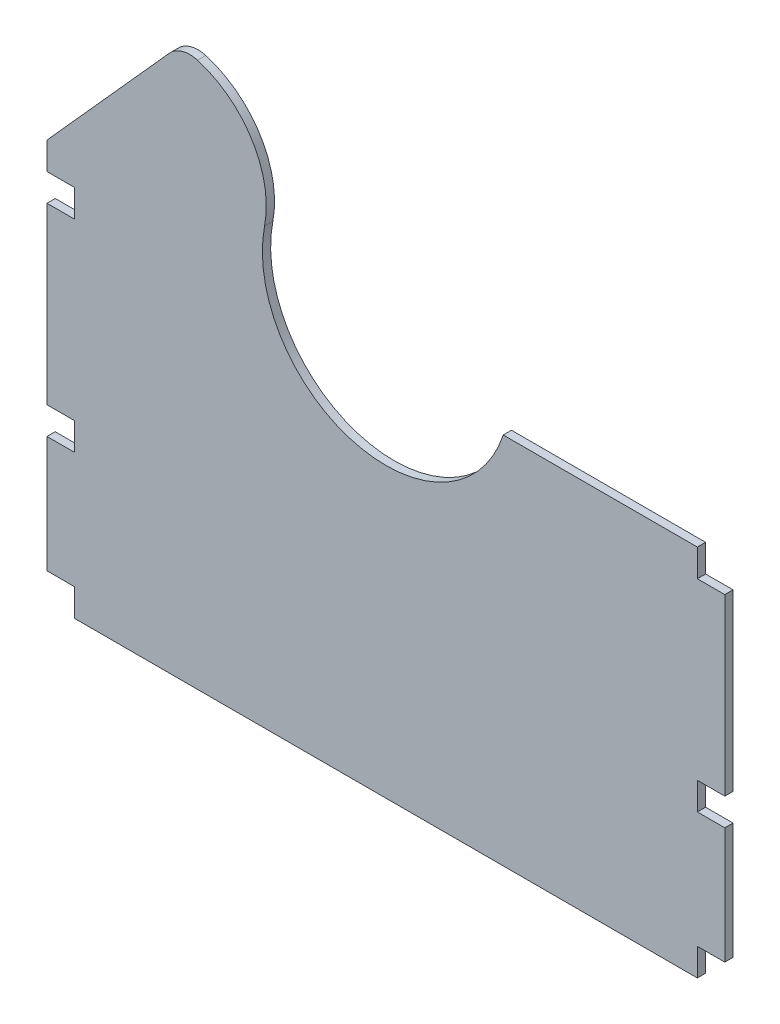
ISO-10303-21;
HEADER;
FILE_DESCRIPTION(('STEP AP214'),'2;1');
FILE_NAME('part.step','',(''),(''),'','','');
FILE_SCHEMA(('AUTOMOTIVE_DESIGN { 1 0 10303 214 1 1 1 1 }'));
ENDSEC;
DATA;
#1=APPLICATION_CONTEXT('core data for automotive mechanical design processes');
#2=APPLICATION_PROTOCOL_DEFINITION('international standard','automotive_design',2000,#1);
#3=PRODUCT_CONTEXT('',#1,'mechanical');
#4=PRODUCT('Part','Part','',(#3));
#5=PRODUCT_RELATED_PRODUCT_CATEGORY('part','',(#4));
#6=PRODUCT_DEFINITION_FORMATION('','',#4);
#7=PRODUCT_DEFINITION_CONTEXT('part definition',#1,'design');
#8=PRODUCT_DEFINITION('design','',#6,#7);
#9=PRODUCT_DEFINITION_SHAPE('','',#8);
#10=(LENGTH_UNIT() NAMED_UNIT(*) SI_UNIT(.MILLI.,.METRE.));
#11=(NAMED_UNIT(*) PLANE_ANGLE_UNIT() SI_UNIT($,.RADIAN.));
#12=(NAMED_UNIT(*) SI_UNIT($,.STERADIAN.) SOLID_ANGLE_UNIT());
#13=UNCERTAINTY_MEASURE_WITH_UNIT(LENGTH_MEASURE(1.E-05),#10,'distance_accuracy_value','');
#14=(GEOMETRIC_REPRESENTATION_CONTEXT(3) GLOBAL_UNCERTAINTY_ASSIGNED_CONTEXT((#13)) GLOBAL_UNIT_ASSIGNED_CONTEXT((#10,
#11,#12)) REPRESENTATION_CONTEXT('',''));
#15=CARTESIAN_POINT('',(0.,0.,0.));
#16=DIRECTION('',(0.,0.,1.));
#17=DIRECTION('',(1.,0.,0.));
#18=AXIS2_PLACEMENT_3D('',#15,#16,#17);
#19=CARTESIAN_POINT('',(0.,127.45,3.));
#20=DIRECTION('',(0.744288047549977,-0.667858744252288,0.));
#21=DIRECTION('',(0.667858744252288,0.744288047549977,0.));
#22=AXIS2_PLACEMENT_3D('',#19,#20,#21);
#23=PLANE('',#22);
#24=DIRECTION('',(-0.667858744252288,-0.744288047549977,0.));
#25=VECTOR('',#24,1.);
#26=CARTESIAN_POINT('',(0.,127.45,3.));
#27=LINE('',#26,#25);
#28=CARTESIAN_POINT('',(61.1917618707652,195.644505740768,3.));
#29=VERTEX_POINT('',#28);
#30=CARTESIAN_POINT('',(16.5999999999984,145.949692780336,3.));
#31=VERTEX_POINT('',#30);
#32=EDGE_CURVE('E326',#29,#31,#27,.T.);
#33=ORIENTED_EDGE('',*,*,#32,.F.);
#34=DIRECTION('',(0.,0.,-1.));
#35=VECTOR('',#34,1.);
#36=CARTESIAN_POINT('',(61.1917618707652,195.644505740768,0.));
#37=LINE('',#36,#35);
#38=CARTESIAN_POINT('',(61.1917618707652,195.644505740768,0.));
#39=VERTEX_POINT('',#38);
#40=EDGE_CURVE('E55',#29,#39,#37,.T.);
#41=ORIENTED_EDGE('',*,*,#40,.T.);
#42=DIRECTION('',(-0.667858744252288,-0.744288047549977,0.));
#43=VECTOR('',#42,1.);
#44=CARTESIAN_POINT('',(0.,127.45,0.));
#45=LINE('',#44,#43);
#46=CARTESIAN_POINT('',(16.5999999999984,145.949692780336,0.));
#47=VERTEX_POINT('',#46);
#48=EDGE_CURVE('E327',#39,#47,#45,.T.);
#49=ORIENTED_EDGE('',*,*,#48,.T.);
#50=DIRECTION('',(0.,0.,1.));
#51=VECTOR('',#50,1.);
#52=CARTESIAN_POINT('',(16.5999999999984,145.949692780336,3.));
#53=LINE('',#52,#51);
#54=EDGE_CURVE('E317',#47,#31,#53,.T.);
#55=ORIENTED_EDGE('',*,*,#54,.T.);
#56=EDGE_LOOP('',(#33,#41,#49,#55));
#57=FACE_BOUND('',#56,.T.);
#58=ADVANCED_FACE('F33',(#57),#23,.F.);
#59=CARTESIAN_POINT('',(16.5999999999984,2.22738494315422E-13,3.));
#60=DIRECTION('',(1.,0.,0.));
#61=DIRECTION('',(0.,1.,0.));
#62=AXIS2_PLACEMENT_3D('',#59,#60,#61);
#63=PLANE('',#62);
#64=DIRECTION('',(0.,-1.,0.));
#65=VECTOR('',#64,1.);
#66=CARTESIAN_POINT('',(16.5999999999984,0.,0.));
#67=LINE('',#66,#65);
#68=CARTESIAN_POINT('',(16.5999999999984,126.,0.));
#69=VERTEX_POINT('',#68);
#70=CARTESIAN_POINT('',(16.5999999999984,62.4,0.));
#71=VERTEX_POINT('',#70);
#72=EDGE_CURVE('E337',#69,#71,#67,.T.);
#73=ORIENTED_EDGE('',*,*,#72,.T.);
#74=DIRECTION('',(0.,0.,1.));
#75=VECTOR('',#74,1.);
#76=CARTESIAN_POINT('',(16.5999999999984,62.4,0.));
#77=LINE('',#76,#75);
#78=CARTESIAN_POINT('',(16.5999999999984,62.4,3.));
#79=VERTEX_POINT('',#78);
#80=EDGE_CURVE('E297',#71,#79,#77,.T.);
#81=ORIENTED_EDGE('',*,*,#80,.T.);
#82=DIRECTION('',(0.,-1.,0.));
#83=VECTOR('',#82,1.);
#84=CARTESIAN_POINT('',(16.5999999999984,2.22738494315422E-13,3.));
#85=LINE('',#84,#83);
#86=CARTESIAN_POINT('',(16.5999999999984,126.,3.));
#87=VERTEX_POINT('',#86);
#88=EDGE_CURVE('E318',#87,#79,#85,.T.);
#89=ORIENTED_EDGE('',*,*,#88,.F.);
#90=DIRECTION('',(0.,0.,1.));
#91=VECTOR('',#90,1.);
#92=CARTESIAN_POINT('',(16.5999999999984,126.,0.));
#93=LINE('',#92,#91);
#94=EDGE_CURVE('E370',#69,#87,#93,.T.);
#95=ORIENTED_EDGE('',*,*,#94,.F.);
#96=EDGE_LOOP('',(#73,#81,#89,#95));
#97=FACE_BOUND('',#96,.T.);
#98=ADVANCED_FACE('F412',(#97),#63,.F.);
#99=CARTESIAN_POINT('',(16.5999999999984,136.,0.));
#100=VERTEX_POINT('',#99);
#101=EDGE_CURVE('E333',#47,#100,#67,.T.);
#102=ORIENTED_EDGE('',*,*,#101,.T.);
#103=DIRECTION('',(0.,0.,1.));
#104=VECTOR('',#103,1.);
#105=CARTESIAN_POINT('',(16.5999999999984,136.,0.));
#106=LINE('',#105,#104);
#107=CARTESIAN_POINT('',(16.5999999999984,136.,3.));
#108=VERTEX_POINT('',#107);
#109=EDGE_CURVE('E384',#100,#108,#106,.T.);
#110=ORIENTED_EDGE('',*,*,#109,.T.);
#111=EDGE_CURVE('E314',#31,#108,#85,.T.);
#112=ORIENTED_EDGE('',*,*,#111,.F.);
#113=ORIENTED_EDGE('',*,*,#54,.F.);
#114=EDGE_LOOP('',(#102,#110,#112,#113));
#115=FACE_BOUND('',#114,.T.);
#116=ADVANCED_FACE('F360',(#115),#63,.F.);
#117=CARTESIAN_POINT('',(263.600000000002,2.22738494315422E-13,3.));
#118=DIRECTION('',(-1.,0.,0.));
#119=DIRECTION('',(0.,0.,1.));
#120=AXIS2_PLACEMENT_3D('',#117,#118,#119);
#121=PLANE('',#120);
#122=DIRECTION('',(0.,1.,0.));
#123=VECTOR('',#122,1.);
#124=CARTESIAN_POINT('',(263.600000000002,2.22738494315422E-13,0.));
#125=LINE('',#124,#123);
#126=CARTESIAN_POINT('',(263.600000000002,62.4,0.));
#127=VERTEX_POINT('',#126);
#128=CARTESIAN_POINT('',(263.600000000002,126.,0.));
#129=VERTEX_POINT('',#128);
#130=EDGE_CURVE('E303',#127,#129,#125,.T.);
#131=ORIENTED_EDGE('',*,*,#130,.T.);
#132=DIRECTION('',(0.,0.,1.));
#133=VECTOR('',#132,1.);
#134=CARTESIAN_POINT('',(263.600000000002,126.,0.));
#135=LINE('',#134,#133);
#136=CARTESIAN_POINT('',(263.600000000002,126.,3.));
#137=VERTEX_POINT('',#136);
#138=EDGE_CURVE('E213',#129,#137,#135,.T.);
#139=ORIENTED_EDGE('',*,*,#138,.T.);
#140=DIRECTION('',(0.,1.,0.));
#141=VECTOR('',#140,1.);
#142=CARTESIAN_POINT('',(263.600000000002,2.22738494315422E-13,3.));
#143=LINE('',#142,#141);
#144=CARTESIAN_POINT('',(263.600000000002,62.4,3.));
#145=VERTEX_POINT('',#144);
#146=EDGE_CURVE('E307',#145,#137,#143,.T.);
#147=ORIENTED_EDGE('',*,*,#146,.F.);
#148=DIRECTION('',(0.,0.,1.));
#149=VECTOR('',#148,1.);
#150=CARTESIAN_POINT('',(263.600000000002,62.4,0.));
#151=LINE('',#150,#149);
#152=EDGE_CURVE('E264',#127,#145,#151,.T.);
#153=ORIENTED_EDGE('',*,*,#152,.F.);
#154=EDGE_LOOP('',(#131,#139,#147,#153));
#155=FACE_BOUND('',#154,.T.);
#156=ADVANCED_FACE('F434',(#155),#121,.F.);
#157=CARTESIAN_POINT('',(263.600000000002,10.0000000000001,0.));
#158=VERTEX_POINT('',#157);
#159=CARTESIAN_POINT('',(263.600000000002,52.4,0.));
#160=VERTEX_POINT('',#159);
#161=EDGE_CURVE('E311',#158,#160,#125,.T.);
#162=ORIENTED_EDGE('',*,*,#161,.T.);
#163=DIRECTION('',(0.,0.,1.));
#164=VECTOR('',#163,1.);
#165=CARTESIAN_POINT('',(263.600000000002,52.4,0.));
#166=LINE('',#165,#164);
#167=CARTESIAN_POINT('',(263.600000000002,52.4,3.));
#168=VERTEX_POINT('',#167);
#169=EDGE_CURVE('E252',#160,#168,#166,.T.);
#170=ORIENTED_EDGE('',*,*,#169,.T.);
#171=CARTESIAN_POINT('',(263.600000000002,10.0000000000001,3.));
#172=VERTEX_POINT('',#171);
#173=EDGE_CURVE('E310',#172,#168,#143,.T.);
#174=ORIENTED_EDGE('',*,*,#173,.F.);
#175=DIRECTION('',(0.,0.,1.));
#176=VECTOR('',#175,1.);
#177=CARTESIAN_POINT('',(263.600000000002,10.0000000000001,0.));
#178=LINE('',#177,#176);
#179=EDGE_CURVE('E275',#158,#172,#178,.T.);
#180=ORIENTED_EDGE('',*,*,#179,.F.);
#181=EDGE_LOOP('',(#162,#170,#174,#180));
#182=FACE_BOUND('',#181,.T.);
#183=ADVANCED_FACE('F426',(#182),#121,.F.);
#184=CARTESIAN_POINT('',(280.2,0.,3.));
#185=DIRECTION('',(0.,1.,0.));
#186=DIRECTION('',(0.,0.,1.));
#187=AXIS2_PLACEMENT_3D('',#184,#185,#186);
#188=PLANE('',#187);
#189=DIRECTION('',(1.,0.,0.));
#190=VECTOR('',#189,1.);
#191=CARTESIAN_POINT('',(280.2,0.,0.));
#192=LINE('',#191,#190);
#193=CARTESIAN_POINT('',(26.5999999999984,0.,0.));
#194=VERTEX_POINT('',#193);
#195=CARTESIAN_POINT('',(253.600000000002,0.,0.));
#196=VERTEX_POINT('',#195);
#197=EDGE_CURVE('E322',#194,#196,#192,.T.);
#198=ORIENTED_EDGE('',*,*,#197,.T.);
#199=DIRECTION('',(0.,0.,1.));
#200=VECTOR('',#199,1.);
#201=CARTESIAN_POINT('',(253.600000000002,0.,0.));
#202=LINE('',#201,#200);
#203=CARTESIAN_POINT('',(253.600000000002,0.,3.));
#204=VERTEX_POINT('',#203);
#205=EDGE_CURVE('E256',#196,#204,#202,.T.);
#206=ORIENTED_EDGE('',*,*,#205,.T.);
#207=DIRECTION('',(1.,0.,0.));
#208=VECTOR('',#207,1.);
#209=CARTESIAN_POINT('',(280.2,0.,3.));
#210=LINE('',#209,#208);
#211=CARTESIAN_POINT('',(26.5999999999984,0.,3.));
#212=VERTEX_POINT('',#211);
#213=EDGE_CURVE('E323',#212,#204,#210,.T.);
#214=ORIENTED_EDGE('',*,*,#213,.F.);
#215=DIRECTION('',(0.,0.,1.));
#216=VECTOR('',#215,1.);
#217=CARTESIAN_POINT('',(26.5999999999984,0.,0.));
#218=LINE('',#217,#216);
#219=EDGE_CURVE('E293',#194,#212,#218,.T.);
#220=ORIENTED_EDGE('',*,*,#219,.F.);
#221=EDGE_LOOP('',(#198,#206,#214,#220));
#222=FACE_BOUND('',#221,.T.);
#223=ADVANCED_FACE('F424',(#222),#188,.F.);
#224=CARTESIAN_POINT('',(0.,0.,3.));
#225=DIRECTION('',(0.,0.,-1.));
#226=DIRECTION('',(-1.,0.,0.));
#227=AXIS2_PLACEMENT_3D('',#224,#225,#226);
#228=PLANE('',#227);
#229=DIRECTION('',(0.,-1.,0.));
#230=VECTOR('',#229,1.);
#231=CARTESIAN_POINT('',(253.600000000002,126.,3.));
#232=LINE('',#231,#230);
#233=CARTESIAN_POINT('',(253.600000000002,136.,3.));
#234=VERTEX_POINT('',#233);
#235=CARTESIAN_POINT('',(253.600000000002,126.,3.));
#236=VERTEX_POINT('',#235);
#237=EDGE_CURVE('E232',#234,#236,#232,.T.);
#238=ORIENTED_EDGE('',*,*,#237,.F.);
#239=DIRECTION('',(1.,0.,0.));
#240=VECTOR('',#239,1.);
#241=CARTESIAN_POINT('',(253.600000000002,136.,3.));
#242=LINE('',#241,#240);
#243=CARTESIAN_POINT('',(182.866809560686,136.,3.));
#244=VERTEX_POINT('',#243);
#245=EDGE_CURVE('E207',#244,#234,#242,.T.);
#246=ORIENTED_EDGE('',*,*,#245,.F.);
#247=CARTESIAN_POINT('',(140.1,150.,3.));
#248=DIRECTION('',(0.,0.,1.));
#249=DIRECTION('',(1.,0.,0.));
#250=AXIS2_PLACEMENT_3D('',#247,#248,#249);
#251=CIRCLE('',#250,45.);
#252=CARTESIAN_POINT('',(95.8980928720264,158.4375,3.));
#253=VERTEX_POINT('',#252);
#254=EDGE_CURVE('E224',#253,#244,#251,.T.);
#255=ORIENTED_EDGE('',*,*,#254,.F.);
#256=CARTESIAN_POINT('',(61.5188317724914,165.,3.));
#257=DIRECTION('',(0.,0.,1.));
#258=DIRECTION('',(1.,0.,0.));
#259=AXIS2_PLACEMENT_3D('',#256,#257,#258);
#260=CIRCLE('',#259,35.);
#261=CARTESIAN_POINT('',(71.4809665757743,198.552285617544,3.));
#262=VERTEX_POINT('',#261);
#263=EDGE_CURVE('E357',#253,#262,#260,.T.);
#264=ORIENTED_EDGE('',*,*,#263,.T.);
#265=CARTESIAN_POINT('',(68.6346423462649,188.965918298245,3.));
#266=DIRECTION('',(0.,0.,-1.));
#267=DIRECTION('',(-1.,0.,0.));
#268=AXIS2_PLACEMENT_3D('',#265,#266,#267);
#269=CIRCLE('',#268,10.);
#270=EDGE_CURVE('E340',#262,#29,#269,.F.);
#271=ORIENTED_EDGE('',*,*,#270,.T.);
#272=ORIENTED_EDGE('',*,*,#32,.T.);
#273=ORIENTED_EDGE('',*,*,#111,.T.);
#274=DIRECTION('',(-1.,0.,0.));
#275=VECTOR('',#274,1.);
#276=CARTESIAN_POINT('',(16.5999999999984,136.,3.));
#277=LINE('',#276,#275);
#278=CARTESIAN_POINT('',(26.5999999999984,136.,3.));
#279=VERTEX_POINT('',#278);
#280=EDGE_CURVE('E382',#279,#108,#277,.T.);
#281=ORIENTED_EDGE('',*,*,#280,.F.);
#282=DIRECTION('',(0.,1.,0.));
#283=VECTOR('',#282,1.);
#284=CARTESIAN_POINT('',(26.5999999999984,126.,3.));
#285=LINE('',#284,#283);
#286=CARTESIAN_POINT('',(26.5999999999984,126.,3.));
#287=VERTEX_POINT('',#286);
#288=EDGE_CURVE('E379',#287,#279,#285,.T.);
#289=ORIENTED_EDGE('',*,*,#288,.F.);
#290=DIRECTION('',(1.,0.,0.));
#291=VECTOR('',#290,1.);
#292=CARTESIAN_POINT('',(16.5999999999984,126.,3.));
#293=LINE('',#292,#291);
#294=EDGE_CURVE('E240',#87,#287,#293,.T.);
#295=ORIENTED_EDGE('',*,*,#294,.F.);
#296=ORIENTED_EDGE('',*,*,#88,.T.);
#297=DIRECTION('',(-1.,0.,0.));
#298=VECTOR('',#297,1.);
#299=CARTESIAN_POINT('',(16.5999999999984,62.4,3.));
#300=LINE('',#299,#298);
#301=CARTESIAN_POINT('',(26.5999999999984,62.4,3.));
#302=VERTEX_POINT('',#301);
#303=EDGE_CURVE('E483',#302,#79,#300,.T.);
#304=ORIENTED_EDGE('',*,*,#303,.F.);
#305=DIRECTION('',(0.,1.,0.));
#306=VECTOR('',#305,1.);
#307=CARTESIAN_POINT('',(26.5999999999984,52.4,3.));
#308=LINE('',#307,#306);
#309=CARTESIAN_POINT('',(26.5999999999984,52.4,3.));
#310=VERTEX_POINT('',#309);
#311=EDGE_CURVE('E480',#310,#302,#308,.T.);
#312=ORIENTED_EDGE('',*,*,#311,.F.);
#313=DIRECTION('',(1.,0.,0.));
#314=VECTOR('',#313,1.);
#315=CARTESIAN_POINT('',(16.5999999999984,52.4,3.));
#316=LINE('',#315,#314);
#317=CARTESIAN_POINT('',(16.5999999999984,52.4,3.));
#318=VERTEX_POINT('',#317);
#319=EDGE_CURVE('E386',#318,#310,#316,.T.);
#320=ORIENTED_EDGE('',*,*,#319,.F.);
#321=CARTESIAN_POINT('',(16.5999999999984,10.,3.));
#322=VERTEX_POINT('',#321);
#323=EDGE_CURVE('E319',#318,#322,#85,.T.);
#324=ORIENTED_EDGE('',*,*,#323,.T.);
#325=DIRECTION('',(-1.,0.,0.));
#326=VECTOR('',#325,1.);
#327=CARTESIAN_POINT('',(16.5999999999984,10.,3.));
#328=LINE('',#327,#326);
#329=CARTESIAN_POINT('',(26.5999999999984,10.,3.));
#330=VERTEX_POINT('',#329);
#331=EDGE_CURVE('E290',#330,#322,#328,.T.);
#332=ORIENTED_EDGE('',*,*,#331,.F.);
#333=DIRECTION('',(0.,1.,0.));
#334=VECTOR('',#333,1.);
#335=CARTESIAN_POINT('',(26.5999999999984,0.,3.));
#336=LINE('',#335,#334);
#337=EDGE_CURVE('E294',#212,#330,#336,.T.);
#338=ORIENTED_EDGE('',*,*,#337,.F.);
#339=ORIENTED_EDGE('',*,*,#213,.T.);
#340=DIRECTION('',(0.,-1.,0.));
#341=VECTOR('',#340,1.);
#342=CARTESIAN_POINT('',(253.600000000002,0.,3.));
#343=LINE('',#342,#341);
#344=CARTESIAN_POINT('',(253.600000000002,10.0000000000001,3.));
#345=VERTEX_POINT('',#344);
#346=EDGE_CURVE('E272',#345,#204,#343,.T.);
#347=ORIENTED_EDGE('',*,*,#346,.F.);
#348=DIRECTION('',(-1.,0.,0.));
#349=VECTOR('',#348,1.);
#350=CARTESIAN_POINT('',(263.600000000002,10.0000000000001,3.));
#351=LINE('',#350,#349);
#352=EDGE_CURVE('E276',#172,#345,#351,.T.);
#353=ORIENTED_EDGE('',*,*,#352,.F.);
#354=ORIENTED_EDGE('',*,*,#173,.T.);
#355=DIRECTION('',(1.,0.,0.));
#356=VECTOR('',#355,1.);
#357=CARTESIAN_POINT('',(263.600000000002,52.4,3.));
#358=LINE('',#357,#356);
#359=CARTESIAN_POINT('',(253.600000000002,52.4,3.));
#360=VERTEX_POINT('',#359);
#361=EDGE_CURVE('E253',#360,#168,#358,.T.);
#362=ORIENTED_EDGE('',*,*,#361,.F.);
#363=DIRECTION('',(0.,-1.,0.));
#364=VECTOR('',#363,1.);
#365=CARTESIAN_POINT('',(253.600000000002,52.4,3.));
#366=LINE('',#365,#364);
#367=CARTESIAN_POINT('',(253.600000000002,62.4,3.));
#368=VERTEX_POINT('',#367);
#369=EDGE_CURVE('E246',#368,#360,#366,.T.);
#370=ORIENTED_EDGE('',*,*,#369,.F.);
#371=DIRECTION('',(-1.,0.,0.));
#372=VECTOR('',#371,1.);
#373=CARTESIAN_POINT('',(263.600000000002,62.4,3.));
#374=LINE('',#373,#372);
#375=EDGE_CURVE('E255',#145,#368,#374,.T.);
#376=ORIENTED_EDGE('',*,*,#375,.F.);
#377=ORIENTED_EDGE('',*,*,#146,.T.);
#378=DIRECTION('',(1.,0.,0.));
#379=VECTOR('',#378,1.);
#380=CARTESIAN_POINT('',(263.600000000002,126.,3.));
#381=LINE('',#380,#379);
#382=EDGE_CURVE('E236',#236,#137,#381,.T.);
#383=ORIENTED_EDGE('',*,*,#382,.F.);
#384=EDGE_LOOP('',(#238,#246,#255,#264,#271,#272,#273,#281,#289,#295,#296,#304,#312,#320,#324,
#332,#338,#339,#347,#353,#354,#362,#370,#376,#377,#383));
#385=FACE_BOUND('',#384,.T.);
#386=ADVANCED_FACE('F354',(#385),#228,.F.);
#387=CARTESIAN_POINT('',(0.,0.,0.));
#388=DIRECTION('',(0.,0.,-1.));
#389=DIRECTION('',(-1.,0.,0.));
#390=AXIS2_PLACEMENT_3D('',#387,#388,#389);
#391=PLANE('',#390);
#392=DIRECTION('',(1.,0.,0.));
#393=VECTOR('',#392,1.);
#394=CARTESIAN_POINT('',(253.600000000002,136.,0.));
#395=LINE('',#394,#393);
#396=CARTESIAN_POINT('',(182.866809560686,136.,0.));
#397=VERTEX_POINT('',#396);
#398=CARTESIAN_POINT('',(253.600000000002,136.,0.));
#399=VERTEX_POINT('',#398);
#400=EDGE_CURVE('E48',#397,#399,#395,.T.);
#401=ORIENTED_EDGE('',*,*,#400,.T.);
#402=DIRECTION('',(0.,-1.,0.));
#403=VECTOR('',#402,1.);
#404=CARTESIAN_POINT('',(253.600000000002,126.,0.));
#405=LINE('',#404,#403);
#406=CARTESIAN_POINT('',(253.600000000002,126.,0.));
#407=VERTEX_POINT('',#406);
#408=EDGE_CURVE('E220',#399,#407,#405,.T.);
#409=ORIENTED_EDGE('',*,*,#408,.T.);
#410=DIRECTION('',(1.,0.,0.));
#411=VECTOR('',#410,1.);
#412=CARTESIAN_POINT('',(263.600000000002,126.,0.));
#413=LINE('',#412,#411);
#414=EDGE_CURVE('E228',#407,#129,#413,.T.);
#415=ORIENTED_EDGE('',*,*,#414,.T.);
#416=ORIENTED_EDGE('',*,*,#130,.F.);
#417=DIRECTION('',(-1.,0.,0.));
#418=VECTOR('',#417,1.);
#419=CARTESIAN_POINT('',(263.600000000002,62.4,0.));
#420=LINE('',#419,#418);
#421=CARTESIAN_POINT('',(253.600000000002,62.4,0.));
#422=VERTEX_POINT('',#421);
#423=EDGE_CURVE('E245',#127,#422,#420,.T.);
#424=ORIENTED_EDGE('',*,*,#423,.T.);
#425=DIRECTION('',(0.,-1.,0.));
#426=VECTOR('',#425,1.);
#427=CARTESIAN_POINT('',(253.600000000002,52.4,0.));
#428=LINE('',#427,#426);
#429=CARTESIAN_POINT('',(253.600000000002,52.4,0.));
#430=VERTEX_POINT('',#429);
#431=EDGE_CURVE('E249',#422,#430,#428,.T.);
#432=ORIENTED_EDGE('',*,*,#431,.T.);
#433=DIRECTION('',(1.,0.,0.));
#434=VECTOR('',#433,1.);
#435=CARTESIAN_POINT('',(263.600000000002,52.4,0.));
#436=LINE('',#435,#434);
#437=EDGE_CURVE('E242',#430,#160,#436,.T.);
#438=ORIENTED_EDGE('',*,*,#437,.T.);
#439=ORIENTED_EDGE('',*,*,#161,.F.);
#440=DIRECTION('',(-1.,0.,0.));
#441=VECTOR('',#440,1.);
#442=CARTESIAN_POINT('',(263.600000000002,10.0000000000001,0.));
#443=LINE('',#442,#441);
#444=CARTESIAN_POINT('',(253.600000000002,10.0000000000001,0.));
#445=VERTEX_POINT('',#444);
#446=EDGE_CURVE('E268',#158,#445,#443,.T.);
#447=ORIENTED_EDGE('',*,*,#446,.T.);
#448=DIRECTION('',(0.,-1.,0.));
#449=VECTOR('',#448,1.);
#450=CARTESIAN_POINT('',(253.600000000002,0.,0.));
#451=LINE('',#450,#449);
#452=EDGE_CURVE('E271',#445,#196,#451,.T.);
#453=ORIENTED_EDGE('',*,*,#452,.T.);
#454=ORIENTED_EDGE('',*,*,#197,.F.);
#455=DIRECTION('',(0.,1.,0.));
#456=VECTOR('',#455,1.);
#457=CARTESIAN_POINT('',(26.5999999999984,0.,0.));
#458=LINE('',#457,#456);
#459=CARTESIAN_POINT('',(26.5999999999984,10.,0.));
#460=VERTEX_POINT('',#459);
#461=EDGE_CURVE('E286',#194,#460,#458,.T.);
#462=ORIENTED_EDGE('',*,*,#461,.T.);
#463=DIRECTION('',(-1.,0.,0.));
#464=VECTOR('',#463,1.);
#465=CARTESIAN_POINT('',(16.5999999999984,10.,0.));
#466=LINE('',#465,#464);
#467=CARTESIAN_POINT('',(16.5999999999984,10.,0.));
#468=VERTEX_POINT('',#467);
#469=EDGE_CURVE('E289',#460,#468,#466,.T.);
#470=ORIENTED_EDGE('',*,*,#469,.T.);
#471=CARTESIAN_POINT('',(16.5999999999984,52.4,0.));
#472=VERTEX_POINT('',#471);
#473=EDGE_CURVE('E329',#472,#468,#67,.T.);
#474=ORIENTED_EDGE('',*,*,#473,.F.);
#475=DIRECTION('',(1.,0.,0.));
#476=VECTOR('',#475,1.);
#477=CARTESIAN_POINT('',(16.5999999999984,52.4,0.));
#478=LINE('',#477,#476);
#479=CARTESIAN_POINT('',(26.5999999999984,52.4,0.));
#480=VERTEX_POINT('',#479);
#481=EDGE_CURVE('E459',#472,#480,#478,.T.);
#482=ORIENTED_EDGE('',*,*,#481,.T.);
#483=DIRECTION('',(0.,1.,0.));
#484=VECTOR('',#483,1.);
#485=CARTESIAN_POINT('',(26.5999999999984,52.4,0.));
#486=LINE('',#485,#484);
#487=CARTESIAN_POINT('',(26.5999999999984,62.4,0.));
#488=VERTEX_POINT('',#487);
#489=EDGE_CURVE('E469',#480,#488,#486,.T.);
#490=ORIENTED_EDGE('',*,*,#489,.T.);
#491=DIRECTION('',(-1.,0.,0.));
#492=VECTOR('',#491,1.);
#493=CARTESIAN_POINT('',(16.5999999999984,62.4,0.));
#494=LINE('',#493,#492);
#495=EDGE_CURVE('E467',#488,#71,#494,.T.);
#496=ORIENTED_EDGE('',*,*,#495,.T.);
#497=ORIENTED_EDGE('',*,*,#72,.F.);
#498=DIRECTION('',(1.,0.,0.));
#499=VECTOR('',#498,1.);
#500=CARTESIAN_POINT('',(16.5999999999984,126.,0.));
#501=LINE('',#500,#499);
#502=CARTESIAN_POINT('',(26.5999999999984,126.,0.));
#503=VERTEX_POINT('',#502);
#504=EDGE_CURVE('E373',#69,#503,#501,.T.);
#505=ORIENTED_EDGE('',*,*,#504,.T.);
#506=DIRECTION('',(0.,1.,0.));
#507=VECTOR('',#506,1.);
#508=CARTESIAN_POINT('',(26.5999999999984,126.,0.));
#509=LINE('',#508,#507);
#510=CARTESIAN_POINT('',(26.5999999999984,136.,0.));
#511=VERTEX_POINT('',#510);
#512=EDGE_CURVE('E368',#503,#511,#509,.T.);
#513=ORIENTED_EDGE('',*,*,#512,.T.);
#514=DIRECTION('',(-1.,0.,0.));
#515=VECTOR('',#514,1.);
#516=CARTESIAN_POINT('',(16.5999999999984,136.,0.));
#517=LINE('',#516,#515);
#518=EDGE_CURVE('E365',#511,#100,#517,.T.);
#519=ORIENTED_EDGE('',*,*,#518,.T.);
#520=ORIENTED_EDGE('',*,*,#101,.F.);
#521=ORIENTED_EDGE('',*,*,#48,.F.);
#522=CARTESIAN_POINT('',(68.6346423462649,188.965918298245,0.));
#523=DIRECTION('',(0.,0.,-1.));
#524=DIRECTION('',(-1.,0.,0.));
#525=AXIS2_PLACEMENT_3D('',#522,#523,#524);
#526=CIRCLE('',#525,10.);
#527=CARTESIAN_POINT('',(71.4809665757743,198.552285617544,0.));
#528=VERTEX_POINT('',#527);
#529=EDGE_CURVE('E41',#39,#528,#526,.T.);
#530=ORIENTED_EDGE('',*,*,#529,.T.);
#531=CARTESIAN_POINT('',(61.5188317724914,165.,0.));
#532=DIRECTION('',(0.,0.,1.));
#533=DIRECTION('',(1.,0.,0.));
#534=AXIS2_PLACEMENT_3D('',#531,#532,#533);
#535=CIRCLE('',#534,35.);
#536=CARTESIAN_POINT('',(95.8980928720264,158.4375,0.));
#537=VERTEX_POINT('',#536);
#538=EDGE_CURVE('E344',#537,#528,#535,.T.);
#539=ORIENTED_EDGE('',*,*,#538,.F.);
#540=CARTESIAN_POINT('',(140.1,150.,0.));
#541=DIRECTION('',(0.,0.,1.));
#542=DIRECTION('',(1.,0.,0.));
#543=AXIS2_PLACEMENT_3D('',#540,#541,#542);
#544=CIRCLE('',#543,45.);
#545=EDGE_CURVE('E223',#537,#397,#544,.T.);
#546=ORIENTED_EDGE('',*,*,#545,.T.);
#547=EDGE_LOOP('',(#401,#409,#415,#416,#424,#432,#438,#439,#447,#453,#454,#462,#470,#474,#482,
#490,#496,#497,#505,#513,#519,#520,#521,#530,#539,#546));
#548=FACE_BOUND('',#547,.T.);
#549=ADVANCED_FACE('F218',(#548),#391,.T.);
#550=ORIENTED_EDGE('',*,*,#323,.F.);
#551=DIRECTION('',(0.,0.,1.));
#552=VECTOR('',#551,1.);
#553=CARTESIAN_POINT('',(16.5999999999984,52.4,0.));
#554=LINE('',#553,#552);
#555=EDGE_CURVE('E471',#472,#318,#554,.T.);
#556=ORIENTED_EDGE('',*,*,#555,.F.);
#557=ORIENTED_EDGE('',*,*,#473,.T.);
#558=DIRECTION('',(0.,0.,1.));
#559=VECTOR('',#558,1.);
#560=CARTESIAN_POINT('',(16.5999999999984,10.,0.));
#561=LINE('',#560,#559);
#562=EDGE_CURVE('E300',#468,#322,#561,.T.);
#563=ORIENTED_EDGE('',*,*,#562,.T.);
#564=EDGE_LOOP('',(#550,#556,#557,#563));
#565=FACE_BOUND('',#564,.T.);
#566=ADVANCED_FACE('F421',(#565),#63,.F.);
#567=CARTESIAN_POINT('',(16.5999999999984,10.,0.));
#568=DIRECTION('',(0.,1.,0.));
#569=DIRECTION('',(0.,0.,1.));
#570=AXIS2_PLACEMENT_3D('',#567,#568,#569);
#571=PLANE('',#570);
#572=ORIENTED_EDGE('',*,*,#331,.T.);
#573=ORIENTED_EDGE('',*,*,#562,.F.);
#574=ORIENTED_EDGE('',*,*,#469,.F.);
#575=DIRECTION('',(0.,0.,1.));
#576=VECTOR('',#575,1.);
#577=CARTESIAN_POINT('',(26.5999999999984,10.,0.));
#578=LINE('',#577,#576);
#579=EDGE_CURVE('E304',#460,#330,#578,.T.);
#580=ORIENTED_EDGE('',*,*,#579,.T.);
#581=EDGE_LOOP('',(#572,#573,#574,#580));
#582=FACE_BOUND('',#581,.T.);
#583=ADVANCED_FACE('F455',(#582),#571,.F.);
#584=CARTESIAN_POINT('',(26.5999999999984,0.,0.));
#585=DIRECTION('',(1.,0.,0.));
#586=DIRECTION('',(0.,0.,-1.));
#587=AXIS2_PLACEMENT_3D('',#584,#585,#586);
#588=PLANE('',#587);
#589=ORIENTED_EDGE('',*,*,#337,.T.);
#590=ORIENTED_EDGE('',*,*,#579,.F.);
#591=ORIENTED_EDGE('',*,*,#461,.F.);
#592=ORIENTED_EDGE('',*,*,#219,.T.);
#593=EDGE_LOOP('',(#589,#590,#591,#592));
#594=FACE_BOUND('',#593,.T.);
#595=ADVANCED_FACE('F451',(#594),#588,.F.);
#596=CARTESIAN_POINT('',(253.600000000002,0.,0.));
#597=DIRECTION('',(-1.,0.,0.));
#598=DIRECTION('',(0.,0.,1.));
#599=AXIS2_PLACEMENT_3D('',#596,#597,#598);
#600=PLANE('',#599);
#601=ORIENTED_EDGE('',*,*,#346,.T.);
#602=ORIENTED_EDGE('',*,*,#205,.F.);
#603=ORIENTED_EDGE('',*,*,#452,.F.);
#604=DIRECTION('',(0.,0.,1.));
#605=VECTOR('',#604,1.);
#606=CARTESIAN_POINT('',(253.600000000002,10.0000000000001,0.));
#607=LINE('',#606,#605);
#608=EDGE_CURVE('E283',#445,#345,#607,.T.);
#609=ORIENTED_EDGE('',*,*,#608,.T.);
#610=EDGE_LOOP('',(#601,#602,#603,#609));
#611=FACE_BOUND('',#610,.T.);
#612=ADVANCED_FACE('F443',(#611),#600,.F.);
#613=CARTESIAN_POINT('',(263.600000000002,10.0000000000001,0.));
#614=DIRECTION('',(0.,1.,0.));
#615=DIRECTION('',(0.,0.,1.));
#616=AXIS2_PLACEMENT_3D('',#613,#614,#615);
#617=PLANE('',#616);
#618=ORIENTED_EDGE('',*,*,#352,.T.);
#619=ORIENTED_EDGE('',*,*,#608,.F.);
#620=ORIENTED_EDGE('',*,*,#446,.F.);
#621=ORIENTED_EDGE('',*,*,#179,.T.);
#622=EDGE_LOOP('',(#618,#619,#620,#621));
#623=FACE_BOUND('',#622,.T.);
#624=ADVANCED_FACE('F543',(#623),#617,.F.);
#625=CARTESIAN_POINT('',(263.600000000002,52.4,0.));
#626=DIRECTION('',(0.,-1.,0.));
#627=DIRECTION('',(0.,0.,-1.));
#628=AXIS2_PLACEMENT_3D('',#625,#626,#627);
#629=PLANE('',#628);
#630=ORIENTED_EDGE('',*,*,#361,.T.);
#631=ORIENTED_EDGE('',*,*,#169,.F.);
#632=ORIENTED_EDGE('',*,*,#437,.F.);
#633=DIRECTION('',(0.,0.,1.));
#634=VECTOR('',#633,1.);
#635=CARTESIAN_POINT('',(253.600000000002,52.4,0.));
#636=LINE('',#635,#634);
#637=EDGE_CURVE('E238',#430,#360,#636,.T.);
#638=ORIENTED_EDGE('',*,*,#637,.T.);
#639=EDGE_LOOP('',(#630,#631,#632,#638));
#640=FACE_BOUND('',#639,.T.);
#641=ADVANCED_FACE('F539',(#640),#629,.F.);
#642=CARTESIAN_POINT('',(253.600000000002,52.4,0.));
#643=DIRECTION('',(-1.,0.,0.));
#644=DIRECTION('',(0.,-1.,0.));
#645=AXIS2_PLACEMENT_3D('',#642,#643,#644);
#646=PLANE('',#645);
#647=ORIENTED_EDGE('',*,*,#369,.T.);
#648=ORIENTED_EDGE('',*,*,#637,.F.);
#649=ORIENTED_EDGE('',*,*,#431,.F.);
#650=DIRECTION('',(0.,0.,1.));
#651=VECTOR('',#650,1.);
#652=CARTESIAN_POINT('',(253.600000000002,62.4,0.));
#653=LINE('',#652,#651);
#654=EDGE_CURVE('E262',#422,#368,#653,.T.);
#655=ORIENTED_EDGE('',*,*,#654,.T.);
#656=EDGE_LOOP('',(#647,#648,#649,#655));
#657=FACE_BOUND('',#656,.T.);
#658=ADVANCED_FACE('F535',(#657),#646,.F.);
#659=CARTESIAN_POINT('',(263.600000000002,62.4,0.));
#660=DIRECTION('',(0.,1.,0.));
#661=DIRECTION('',(0.,0.,1.));
#662=AXIS2_PLACEMENT_3D('',#659,#660,#661);
#663=PLANE('',#662);
#664=ORIENTED_EDGE('',*,*,#375,.T.);
#665=ORIENTED_EDGE('',*,*,#654,.F.);
#666=ORIENTED_EDGE('',*,*,#423,.F.);
#667=ORIENTED_EDGE('',*,*,#152,.T.);
#668=EDGE_LOOP('',(#664,#665,#666,#667));
#669=FACE_BOUND('',#668,.T.);
#670=ADVANCED_FACE('F532',(#669),#663,.F.);
#671=CARTESIAN_POINT('',(263.600000000002,126.,0.));
#672=DIRECTION('',(0.,-1.,0.));
#673=DIRECTION('',(0.,0.,-1.));
#674=AXIS2_PLACEMENT_3D('',#671,#672,#673);
#675=PLANE('',#674);
#676=ORIENTED_EDGE('',*,*,#382,.T.);
#677=ORIENTED_EDGE('',*,*,#138,.F.);
#678=ORIENTED_EDGE('',*,*,#414,.F.);
#679=DIRECTION('',(0.,0.,1.));
#680=VECTOR('',#679,1.);
#681=CARTESIAN_POINT('',(253.600000000002,126.,0.));
#682=LINE('',#681,#680);
#683=EDGE_CURVE('E212',#407,#236,#682,.T.);
#684=ORIENTED_EDGE('',*,*,#683,.T.);
#685=EDGE_LOOP('',(#676,#677,#678,#684));
#686=FACE_BOUND('',#685,.T.);
#687=ADVANCED_FACE('F408',(#686),#675,.F.);
#688=CARTESIAN_POINT('',(253.600000000002,126.,0.));
#689=DIRECTION('',(-1.,0.,0.));
#690=DIRECTION('',(0.,0.,1.));
#691=AXIS2_PLACEMENT_3D('',#688,#689,#690);
#692=PLANE('',#691);
#693=ORIENTED_EDGE('',*,*,#237,.T.);
#694=ORIENTED_EDGE('',*,*,#683,.F.);
#695=ORIENTED_EDGE('',*,*,#408,.F.);
#696=DIRECTION('',(0.,0.,1.));
#697=VECTOR('',#696,1.);
#698=CARTESIAN_POINT('',(253.600000000002,136.,0.));
#699=LINE('',#698,#697);
#700=EDGE_CURVE('E204',#399,#234,#699,.T.);
#701=ORIENTED_EDGE('',*,*,#700,.T.);
#702=EDGE_LOOP('',(#693,#694,#695,#701));
#703=FACE_BOUND('',#702,.T.);
#704=ADVANCED_FACE('F226',(#703),#692,.F.);
#705=CARTESIAN_POINT('',(16.5999999999984,136.,0.));
#706=DIRECTION('',(0.,1.,0.));
#707=DIRECTION('',(0.,0.,1.));
#708=AXIS2_PLACEMENT_3D('',#705,#706,#707);
#709=PLANE('',#708);
#710=ORIENTED_EDGE('',*,*,#280,.T.);
#711=ORIENTED_EDGE('',*,*,#109,.F.);
#712=ORIENTED_EDGE('',*,*,#518,.F.);
#713=DIRECTION('',(0.,0.,1.));
#714=VECTOR('',#713,1.);
#715=CARTESIAN_POINT('',(26.5999999999984,136.,0.));
#716=LINE('',#715,#714);
#717=EDGE_CURVE('E387',#511,#279,#716,.T.);
#718=ORIENTED_EDGE('',*,*,#717,.T.);
#719=EDGE_LOOP('',(#710,#711,#712,#718));
#720=FACE_BOUND('',#719,.T.);
#721=ADVANCED_FACE('F399',(#720),#709,.F.);
#722=CARTESIAN_POINT('',(26.5999999999984,126.,0.));
#723=DIRECTION('',(1.,0.,0.));
#724=DIRECTION('',(0.,0.,-1.));
#725=AXIS2_PLACEMENT_3D('',#722,#723,#724);
#726=PLANE('',#725);
#727=ORIENTED_EDGE('',*,*,#288,.T.);
#728=ORIENTED_EDGE('',*,*,#717,.F.);
#729=ORIENTED_EDGE('',*,*,#512,.F.);
#730=DIRECTION('',(0.,0.,1.));
#731=VECTOR('',#730,1.);
#732=CARTESIAN_POINT('',(26.5999999999984,126.,0.));
#733=LINE('',#732,#731);
#734=EDGE_CURVE('E372',#503,#287,#733,.T.);
#735=ORIENTED_EDGE('',*,*,#734,.T.);
#736=EDGE_LOOP('',(#727,#728,#729,#735));
#737=FACE_BOUND('',#736,.T.);
#738=ADVANCED_FACE('F390',(#737),#726,.F.);
#739=CARTESIAN_POINT('',(16.5999999999984,126.,0.));
#740=DIRECTION('',(0.,-1.,0.));
#741=DIRECTION('',(0.,0.,-1.));
#742=AXIS2_PLACEMENT_3D('',#739,#740,#741);
#743=PLANE('',#742);
#744=ORIENTED_EDGE('',*,*,#294,.T.);
#745=ORIENTED_EDGE('',*,*,#734,.F.);
#746=ORIENTED_EDGE('',*,*,#504,.F.);
#747=ORIENTED_EDGE('',*,*,#94,.T.);
#748=EDGE_LOOP('',(#744,#745,#746,#747));
#749=FACE_BOUND('',#748,.T.);
#750=ADVANCED_FACE('F395',(#749),#743,.F.);
#751=CARTESIAN_POINT('',(16.5999999999984,62.4,0.));
#752=DIRECTION('',(0.,1.,0.));
#753=DIRECTION('',(0.,0.,1.));
#754=AXIS2_PLACEMENT_3D('',#751,#752,#753);
#755=PLANE('',#754);
#756=ORIENTED_EDGE('',*,*,#303,.T.);
#757=ORIENTED_EDGE('',*,*,#80,.F.);
#758=ORIENTED_EDGE('',*,*,#495,.F.);
#759=DIRECTION('',(0.,0.,1.));
#760=VECTOR('',#759,1.);
#761=CARTESIAN_POINT('',(26.5999999999984,62.4,0.));
#762=LINE('',#761,#760);
#763=EDGE_CURVE('E486',#488,#302,#762,.T.);
#764=ORIENTED_EDGE('',*,*,#763,.T.);
#765=EDGE_LOOP('',(#756,#757,#758,#764));
#766=FACE_BOUND('',#765,.T.);
#767=ADVANCED_FACE('F496',(#766),#755,.F.);
#768=CARTESIAN_POINT('',(26.5999999999984,52.4,0.));
#769=DIRECTION('',(1.,0.,0.));
#770=DIRECTION('',(0.,1.,0.));
#771=AXIS2_PLACEMENT_3D('',#768,#769,#770);
#772=PLANE('',#771);
#773=ORIENTED_EDGE('',*,*,#311,.T.);
#774=ORIENTED_EDGE('',*,*,#763,.F.);
#775=ORIENTED_EDGE('',*,*,#489,.F.);
#776=DIRECTION('',(0.,0.,1.));
#777=VECTOR('',#776,1.);
#778=CARTESIAN_POINT('',(26.5999999999984,52.4,0.));
#779=LINE('',#778,#777);
#780=EDGE_CURVE('E473',#480,#310,#779,.T.);
#781=ORIENTED_EDGE('',*,*,#780,.T.);
#782=EDGE_LOOP('',(#773,#774,#775,#781));
#783=FACE_BOUND('',#782,.T.);
#784=ADVANCED_FACE('F489',(#783),#772,.F.);
#785=CARTESIAN_POINT('',(16.5999999999984,52.4,0.));
#786=DIRECTION('',(0.,-1.,0.));
#787=DIRECTION('',(0.,0.,-1.));
#788=AXIS2_PLACEMENT_3D('',#785,#786,#787);
#789=PLANE('',#788);
#790=ORIENTED_EDGE('',*,*,#319,.T.);
#791=ORIENTED_EDGE('',*,*,#780,.F.);
#792=ORIENTED_EDGE('',*,*,#481,.F.);
#793=ORIENTED_EDGE('',*,*,#555,.T.);
#794=EDGE_LOOP('',(#790,#791,#792,#793));
#795=FACE_BOUND('',#794,.T.);
#796=ADVANCED_FACE('F494',(#795),#789,.F.);
#797=CARTESIAN_POINT('',(140.1,150.,0.));
#798=DIRECTION('',(0.,0.,1.));
#799=DIRECTION('',(1.,0.,0.));
#800=AXIS2_PLACEMENT_3D('',#797,#798,#799);
#801=CYLINDRICAL_SURFACE('',#800,45.);
#802=ORIENTED_EDGE('',*,*,#254,.T.);
#803=DIRECTION('',(0.,0.,1.));
#804=VECTOR('',#803,1.);
#805=CARTESIAN_POINT('',(182.866809560686,136.,0.));
#806=LINE('',#805,#804);
#807=EDGE_CURVE('E11',#244,#397,#806,.F.);
#808=ORIENTED_EDGE('',*,*,#807,.T.);
#809=ORIENTED_EDGE('',*,*,#545,.F.);
#810=DIRECTION('',(0.,0.,1.));
#811=VECTOR('',#810,1.);
#812=CARTESIAN_POINT('',(95.8980928720264,158.4375,0.));
#813=LINE('',#812,#811);
#814=EDGE_CURVE('E279',#537,#253,#813,.T.);
#815=ORIENTED_EDGE('',*,*,#814,.T.);
#816=EDGE_LOOP('',(#802,#808,#809,#815));
#817=FACE_BOUND('',#816,.T.);
#818=ADVANCED_FACE('F506',(#817),#801,.F.);
#819=CARTESIAN_POINT('',(61.5188317724914,165.,0.));
#820=DIRECTION('',(0.,0.,1.));
#821=DIRECTION('',(1.,0.,0.));
#822=AXIS2_PLACEMENT_3D('',#819,#820,#821);
#823=CYLINDRICAL_SURFACE('',#822,35.);
#824=ORIENTED_EDGE('',*,*,#538,.T.);
#825=DIRECTION('',(0.,0.,1.));
#826=VECTOR('',#825,1.);
#827=CARTESIAN_POINT('',(71.4809665757743,198.552285617544,0.));
#828=LINE('',#827,#826);
#829=EDGE_CURVE('E336',#528,#262,#828,.T.);
#830=ORIENTED_EDGE('',*,*,#829,.T.);
#831=ORIENTED_EDGE('',*,*,#263,.F.);
#832=ORIENTED_EDGE('',*,*,#814,.F.);
#833=EDGE_LOOP('',(#824,#830,#831,#832));
#834=FACE_BOUND('',#833,.T.);
#835=ADVANCED_FACE('F349',(#834),#823,.T.);
#836=CARTESIAN_POINT('',(68.6346423462649,188.965918298245,0.));
#837=DIRECTION('',(0.,0.,1.));
#838=DIRECTION('',(1.,0.,0.));
#839=AXIS2_PLACEMENT_3D('',#836,#837,#838);
#840=CYLINDRICAL_SURFACE('',#839,10.);
#841=ORIENTED_EDGE('',*,*,#529,.F.);
#842=ORIENTED_EDGE('',*,*,#40,.F.);
#843=ORIENTED_EDGE('',*,*,#270,.F.);
#844=ORIENTED_EDGE('',*,*,#829,.F.);
#845=EDGE_LOOP('',(#841,#842,#843,#844));
#846=FACE_BOUND('',#845,.T.);
#847=ADVANCED_FACE('F35',(#846),#840,.T.);
#848=CARTESIAN_POINT('',(253.600000000002,136.,0.));
#849=DIRECTION('',(0.,-1.,0.));
#850=DIRECTION('',(0.,0.,-1.));
#851=AXIS2_PLACEMENT_3D('',#848,#849,#850);
#852=PLANE('',#851);
#853=ORIENTED_EDGE('',*,*,#245,.T.);
#854=ORIENTED_EDGE('',*,*,#700,.F.);
#855=ORIENTED_EDGE('',*,*,#400,.F.);
#856=ORIENTED_EDGE('',*,*,#807,.F.);
#857=EDGE_LOOP('',(#853,#854,#855,#856));
#858=FACE_BOUND('',#857,.T.);
#859=ADVANCED_FACE('F205',(#858),#852,.F.);
#860=CLOSED_SHELL('',(#58,#98,#116,#156,#183,#223,#386,#549,#566,#583,#595,#612,#624,#641,#658,
#670,#687,#704,#721,#738,#750,#767,#784,#796,#818,#835,#847,#859));
#861=MANIFOLD_SOLID_BREP('B2',#860);
#862=ADVANCED_BREP_SHAPE_REPRESENTATION('',(#18,#861),#14);
#863=SHAPE_DEFINITION_REPRESENTATION(#9,#862);
ENDSEC;
END-ISO-10303-21;
